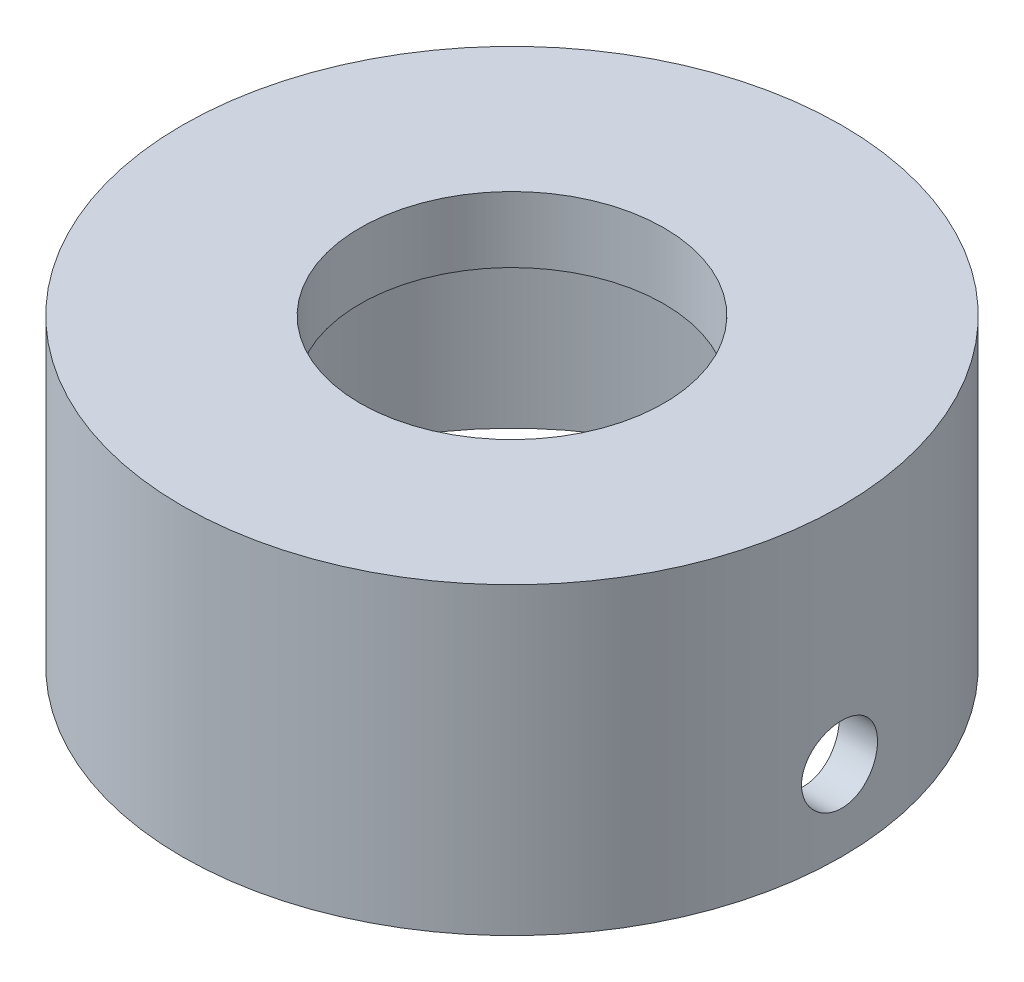
ISO-10303-21;
HEADER;
FILE_DESCRIPTION(('STEP AP214'),'2;1');
FILE_NAME('part.step','',(''),(''),'','','');
FILE_SCHEMA(('AUTOMOTIVE_DESIGN { 1 0 10303 214 1 1 1 1 }'));
ENDSEC;
DATA;
#1=APPLICATION_CONTEXT('core data for automotive mechanical design processes');
#2=APPLICATION_PROTOCOL_DEFINITION('international standard','automotive_design',2000,#1);
#3=PRODUCT_CONTEXT('',#1,'mechanical');
#4=PRODUCT('Part','Part','',(#3));
#5=PRODUCT_RELATED_PRODUCT_CATEGORY('part','',(#4));
#6=PRODUCT_DEFINITION_FORMATION('','',#4);
#7=PRODUCT_DEFINITION_CONTEXT('part definition',#1,'design');
#8=PRODUCT_DEFINITION('design','',#6,#7);
#9=PRODUCT_DEFINITION_SHAPE('','',#8);
#10=(LENGTH_UNIT() NAMED_UNIT(*) SI_UNIT(.MILLI.,.METRE.));
#11=(NAMED_UNIT(*) PLANE_ANGLE_UNIT() SI_UNIT($,.RADIAN.));
#12=(NAMED_UNIT(*) SI_UNIT($,.STERADIAN.) SOLID_ANGLE_UNIT());
#13=UNCERTAINTY_MEASURE_WITH_UNIT(LENGTH_MEASURE(1.E-05),#10,'distance_accuracy_value','');
#14=(GEOMETRIC_REPRESENTATION_CONTEXT(3) GLOBAL_UNCERTAINTY_ASSIGNED_CONTEXT((#13)) GLOBAL_UNIT_ASSIGNED_CONTEXT((#10,
#11,#12)) REPRESENTATION_CONTEXT('',''));
#15=CARTESIAN_POINT('',(0.,0.,0.));
#16=DIRECTION('',(0.,0.,1.));
#17=DIRECTION('',(1.,0.,0.));
#18=AXIS2_PLACEMENT_3D('',#15,#16,#17);
#19=CARTESIAN_POINT('',(0.,-19.05,0.));
#20=DIRECTION('',(0.,1.,0.));
#21=DIRECTION('',(0.,0.,1.));
#22=AXIS2_PLACEMENT_3D('',#19,#20,#21);
#23=CYLINDRICAL_SURFACE('',#22,9.525);
#24=CARTESIAN_POINT('',(0.,0.,0.));
#25=DIRECTION('',(0.,1.,0.));
#26=DIRECTION('',(0.,0.,1.));
#27=AXIS2_PLACEMENT_3D('',#24,#25,#26);
#28=CIRCLE('',#27,9.525);
#29=CARTESIAN_POINT('',(0.,0.,9.525));
#30=VERTEX_POINT('',#29);
#31=EDGE_CURVE('E58',#30,#30,#28,.T.);
#32=CARTESIAN_POINT('',(0.,-4.1275,0.));
#33=DIRECTION('',(0.,-1.,0.));
#34=DIRECTION('',(0.,0.,-1.));
#35=AXIS2_PLACEMENT_3D('',#32,#33,#34);
#36=CIRCLE('',#35,9.525);
#37=CARTESIAN_POINT('',(0.,-4.1275,9.525));
#38=VERTEX_POINT('',#37);
#39=EDGE_CURVE('E56',#38,#38,#36,.F.);
#40=CARTESIAN_POINT('',(0.,0.,9.525));
#41=CARTESIAN_POINT('',(0.,-0.0429947916666661,9.525));
#42=CARTESIAN_POINT('',(0.,-0.0859895833333323,9.525));
#43=CARTESIAN_POINT('',(0.,-0.171979166666666,9.525));
#44=CARTESIAN_POINT('',(0.,-0.214973958333333,9.525));
#45=CARTESIAN_POINT('',(0.,-0.300963541666667,9.525));
#46=CARTESIAN_POINT('',(0.,-0.343958333333333,9.525));
#47=CARTESIAN_POINT('',(0.,-0.429947916666666,9.525));
#48=CARTESIAN_POINT('',(0.,-0.472942708333333,9.525));
#49=CARTESIAN_POINT('',(0.,-0.558932291666667,9.525));
#50=CARTESIAN_POINT('',(0.,-0.601927083333333,9.525));
#51=CARTESIAN_POINT('',(0.,-0.687916666666667,9.525));
#52=CARTESIAN_POINT('',(0.,-0.730911458333334,9.525));
#53=CARTESIAN_POINT('',(0.,-0.816901041666667,9.525));
#54=CARTESIAN_POINT('',(0.,-0.859895833333334,9.525));
#55=CARTESIAN_POINT('',(0.,-0.945885416666667,9.525));
#56=CARTESIAN_POINT('',(0.,-0.988880208333334,9.525));
#57=CARTESIAN_POINT('',(0.,-1.07486979166667,9.525));
#58=CARTESIAN_POINT('',(0.,-1.11786458333333,9.525));
#59=CARTESIAN_POINT('',(0.,-1.20385416666667,9.525));
#60=CARTESIAN_POINT('',(0.,-1.24684895833333,9.525));
#61=CARTESIAN_POINT('',(0.,-1.33283854166667,9.525));
#62=CARTESIAN_POINT('',(0.,-1.37583333333333,9.525));
#63=CARTESIAN_POINT('',(0.,-1.46182291666667,9.525));
#64=CARTESIAN_POINT('',(0.,-1.50481770833333,9.525));
#65=CARTESIAN_POINT('',(0.,-1.59080729166667,9.525));
#66=CARTESIAN_POINT('',(0.,-1.63380208333333,9.525));
#67=CARTESIAN_POINT('',(0.,-1.71979166666667,9.525));
#68=CARTESIAN_POINT('',(0.,-1.76278645833334,9.525));
#69=CARTESIAN_POINT('',(0.,-1.84877604166667,9.525));
#70=CARTESIAN_POINT('',(0.,-1.89177083333333,9.525));
#71=CARTESIAN_POINT('',(0.,-1.97776041666667,9.525));
#72=CARTESIAN_POINT('',(0.,-2.02075520833334,9.525));
#73=CARTESIAN_POINT('',(0.,-2.10674479166667,9.525));
#74=CARTESIAN_POINT('',(0.,-2.14973958333334,9.525));
#75=CARTESIAN_POINT('',(0.,-2.23572916666667,9.525));
#76=CARTESIAN_POINT('',(0.,-2.27872395833333,9.525));
#77=CARTESIAN_POINT('',(0.,-2.36471354166667,9.525));
#78=CARTESIAN_POINT('',(0.,-2.40770833333333,9.525));
#79=CARTESIAN_POINT('',(0.,-2.49369791666667,9.525));
#80=CARTESIAN_POINT('',(0.,-2.53669270833333,9.525));
#81=CARTESIAN_POINT('',(0.,-2.62268229166667,9.525));
#82=CARTESIAN_POINT('',(0.,-2.66567708333333,9.525));
#83=CARTESIAN_POINT('',(0.,-2.75166666666667,9.525));
#84=CARTESIAN_POINT('',(0.,-2.79466145833333,9.525));
#85=CARTESIAN_POINT('',(0.,-2.88065104166667,9.525));
#86=CARTESIAN_POINT('',(0.,-2.92364583333334,9.525));
#87=CARTESIAN_POINT('',(0.,-3.00963541666667,9.525));
#88=CARTESIAN_POINT('',(0.,-3.05263020833334,9.525));
#89=CARTESIAN_POINT('',(0.,-3.13861979166667,9.525));
#90=CARTESIAN_POINT('',(0.,-3.18161458333334,9.525));
#91=CARTESIAN_POINT('',(0.,-3.26760416666667,9.525));
#92=CARTESIAN_POINT('',(0.,-3.31059895833334,9.525));
#93=CARTESIAN_POINT('',(0.,-3.39658854166667,9.525));
#94=CARTESIAN_POINT('',(0.,-3.43958333333333,9.525));
#95=CARTESIAN_POINT('',(0.,-3.52557291666667,9.525));
#96=CARTESIAN_POINT('',(0.,-3.56856770833333,9.525));
#97=CARTESIAN_POINT('',(0.,-3.65455729166667,9.525));
#98=CARTESIAN_POINT('',(0.,-3.69755208333333,9.525));
#99=CARTESIAN_POINT('',(0.,-3.78354166666667,9.525));
#100=CARTESIAN_POINT('',(0.,-3.82653645833333,9.525));
#101=CARTESIAN_POINT('',(0.,-3.91252604166667,9.525));
#102=CARTESIAN_POINT('',(0.,-3.95552083333333,9.525));
#103=CARTESIAN_POINT('',(0.,-4.04151041666667,9.525));
#104=CARTESIAN_POINT('',(0.,-4.08450520833333,9.525));
#105=CARTESIAN_POINT('',(0.,-4.1275,9.525));
#106=B_SPLINE_CURVE_WITH_KNOTS('',3,(#40,#41,#42,#43,#44,#45,#46,#47,#48,#49,#50,#51,#52,#53,
#54,#55,#56,#57,#58,#59,#60,#61,#62,#63,#64,#65,#66,#67,#68,#69,#70,#71,#72,#73,#74,#75,#76,#77,
#78,#79,#80,#81,#82,#83,#84,#85,#86,#87,#88,#89,#90,#91,#92,#93,#94,#95,#96,#97,#98,#99,#100,
#101,#102,#103,#104,#105),.UNSPECIFIED.,.F.,.F.,(4,2,2,2,2,2,2,2,2,2,2,2,2,2,2,2,2,2,2,2,2,2,2,
2,2,2,2,2,2,2,2,2,4),(0.,0.128984374999998,0.25796875,0.386953124999999,0.515937500000001,
0.644921874999999,0.773906250000001,0.902890625,1.031875,1.160859375,1.28984375,1.418828125,
1.5478125,1.676796875,1.80578125,1.934765625,2.06375,2.192734375,2.32171875,2.450703125,
2.5796875,2.708671875,2.83765625,2.966640625,3.095625,3.224609375,3.35359375,3.482578125,
3.6115625,3.740546875,3.86953125,3.998515625,4.1275),.UNSPECIFIED.);
#107=EDGE_CURVE('BSEAM32',#30,#38,#106,.T.);
#108=ORIENTED_EDGE('',*,*,#31,.T.);
#109=ORIENTED_EDGE('',*,*,#39,.F.);
#110=ORIENTED_EDGE('',*,*,#107,.T.);
#111=ORIENTED_EDGE('',*,*,#107,.F.);
#112=EDGE_LOOP('',(#108,#110,#109,#111));
#113=FACE_BOUND('',#112,.T.);
#114=ADVANCED_FACE('F32',(#113),#23,.F.);
#115=CARTESIAN_POINT('',(0.,-19.05,0.));
#116=DIRECTION('',(0.,1.,0.));
#117=DIRECTION('',(0.,0.,1.));
#118=AXIS2_PLACEMENT_3D('',#115,#116,#117);
#119=CYLINDRICAL_SURFACE('',#118,20.66925);
#120=CARTESIAN_POINT('',(-20.66925,-11.65225,0.));
#121=CARTESIAN_POINT('',(-20.669248263077,-11.6522557108431,-0.133282101014154));
#122=CARTESIAN_POINT('',(-20.6679471798083,-11.6634777030084,-0.266649511790171));
#123=CARTESIAN_POINT('',(-20.6628820330367,-11.7080705214079,-0.529678895517219));
#124=CARTESIAN_POINT('',(-20.6591153385506,-11.7414650078234,-0.659336755687313));
#125=CARTESIAN_POINT('',(-20.6495436650439,-11.8294108069728,-0.911100628269493));
#126=CARTESIAN_POINT('',(-20.6437399996008,-11.8839484874994,-1.03321144798518));
#127=CARTESIAN_POINT('',(-20.6307413145014,-12.012604083965,-1.26652212246347));
#128=CARTESIAN_POINT('',(-20.6235465493894,-12.0867184186624,-1.37772396775443));
#129=CARTESIAN_POINT('',(-20.6085321712339,-12.2527972314889,-1.58660849927668));
#130=CARTESIAN_POINT('',(-20.6007100611798,-12.3448353595614,-1.6842324545825));
#131=CARTESIAN_POINT('',(-20.5853429382,-12.5439913210551,-1.8626846014047));
#132=CARTESIAN_POINT('',(-20.5777979388476,-12.6511098919075,-1.94351197109189));
#133=CARTESIAN_POINT('',(-20.5638144318017,-12.8777623646645,-2.08629124318106));
#134=CARTESIAN_POINT('',(-20.5573791301346,-12.9973306902304,-2.14818884132314));
#135=CARTESIAN_POINT('',(-20.5463759038668,-13.2452510810466,-2.25100476396389));
#136=CARTESIAN_POINT('',(-20.5418079188455,-13.3736028619341,-2.29192376727711));
#137=CARTESIAN_POINT('',(-20.5350799466034,-13.6348409825155,-2.35144413472007));
#138=CARTESIAN_POINT('',(-20.5329093312233,-13.7677045944783,-2.37014403011372));
#139=CARTESIAN_POINT('',(-20.5311891780485,-14.0347007304639,-2.38500012206609));
#140=CARTESIAN_POINT('',(-20.5316395501575,-14.1688332107112,-2.38115709353598));
#141=CARTESIAN_POINT('',(-20.5351007640432,-14.4338760129371,-2.35111744243651));
#142=CARTESIAN_POINT('',(-20.5380992194161,-14.5647987754064,-2.32502895445263));
#143=CARTESIAN_POINT('',(-20.5462994250412,-14.8203954249362,-2.25140746488244));
#144=CARTESIAN_POINT('',(-20.5515012137591,-14.9450692028598,-2.20387408891188));
#145=CARTESIAN_POINT('',(-20.5635361186033,-15.1849671525314,-2.08859458857701));
#146=CARTESIAN_POINT('',(-20.5703730527885,-15.300168346954,-2.02080106296767));
#147=CARTESIAN_POINT('',(-20.5849048464295,-15.5175993547753,-1.86695964227599));
#148=CARTESIAN_POINT('',(-20.5925997392292,-15.6198286636994,-1.78091103760417));
#149=CARTESIAN_POINT('',(-20.6080355640445,-15.8090419369866,-1.59240082371126));
#150=CARTESIAN_POINT('',(-20.615776501445,-15.8959329916167,-1.48984593154622));
#151=CARTESIAN_POINT('',(-20.6303898441605,-16.0512812037243,-1.2715566193825));
#152=CARTESIAN_POINT('',(-20.6372622479514,-16.1197383288525,-1.15582217625595));
#153=CARTESIAN_POINT('',(-20.6493675735207,-16.2362739145537,-0.914390427957393));
#154=CARTESIAN_POINT('',(-20.6546000643037,-16.284347019048,-0.788690514557274));
#155=CARTESIAN_POINT('',(-20.6628319241393,-16.3586785617708,-0.530929178317458));
#156=CARTESIAN_POINT('',(-20.6658313819213,-16.3849378667737,-0.398868008463851));
#157=CARTESIAN_POINT('',(-20.6692477465197,-16.41477705394,-0.13293675412025));
#158=CARTESIAN_POINT('',(-20.6696792376698,-16.4184850153009,0.000918779261839986));
#159=CARTESIAN_POINT('',(-20.6679503164661,-16.4034535915521,0.267344328670689));
#160=CARTESIAN_POINT('',(-20.6657899508357,-16.3847146110929,0.399914367827595));
#161=CARTESIAN_POINT('',(-20.6591292305178,-16.3254275799692,0.659631277198224));
#162=CARTESIAN_POINT('',(-20.6546353801959,-16.2849401402966,0.786792164392998));
#163=CARTESIAN_POINT('',(-20.6438112132228,-16.1833681907582,1.03251848117205));
#164=CARTESIAN_POINT('',(-20.6374808428918,-16.1222830788344,1.15108365938566));
#165=CARTESIAN_POINT('',(-20.6236539665961,-15.9809366504814,1.37682790766961));
#166=CARTESIAN_POINT('',(-20.6161524401901,-15.9005919399264,1.48395444909443));
#167=CARTESIAN_POINT('',(-20.6008393956953,-15.7231256463966,1.68324719608323));
#168=CARTESIAN_POINT('',(-20.5930278672178,-15.6260035008176,1.77541289975855));
#169=CARTESIAN_POINT('',(-20.5779306841633,-15.4171772870563,1.94261810732791));
#170=CARTESIAN_POINT('',(-20.570647741268,-15.3054052927975,2.01757305689535));
#171=CARTESIAN_POINT('',(-20.5574756219329,-15.0707840366538,2.14764613190881));
#172=CARTESIAN_POINT('',(-20.551586421171,-14.9479349681264,2.20276460352973));
#173=CARTESIAN_POINT('',(-20.5418864919658,-14.6949267683759,2.29146126234889));
#174=CARTESIAN_POINT('',(-20.5380710604672,-14.5647849225858,2.32508822041776));
#175=CARTESIAN_POINT('',(-20.5329367553565,-14.3006554148425,2.37000488597404));
#176=CARTESIAN_POINT('',(-20.5316177843877,-14.166667903069,2.38129546453305));
#177=CARTESIAN_POINT('',(-20.5316282650218,-13.8994912960084,2.38120452515172));
#178=CARTESIAN_POINT('',(-20.5329422008559,-13.7663021352212,2.36995583158293));
#179=CARTESIAN_POINT('',(-20.5380372070857,-13.503720136929,2.32538576954833));
#180=CARTESIAN_POINT('',(-20.5418182789023,-13.3743273016106,2.29206438836939));
#181=CARTESIAN_POINT('',(-20.5514169365184,-13.1230216342412,2.20433436924064));
#182=CARTESIAN_POINT('',(-20.557234003247,-13.0011069049713,2.14993110567493));
#183=CARTESIAN_POINT('',(-20.5702501591,-12.768116452789,2.02159484442901));
#184=CARTESIAN_POINT('',(-20.577449255164,-12.6570407843072,1.94766174868242));
#185=CARTESIAN_POINT('',(-20.5924691820061,-12.4482015124226,1.78186880192908));
#186=CARTESIAN_POINT('',(-20.6002933004258,-12.3505167934697,1.68990987768988));
#187=CARTESIAN_POINT('',(-20.6156521850255,-12.1719118263203,1.49087932948802));
#188=CARTESIAN_POINT('',(-20.6231868821197,-12.0909955607902,1.38380412539524));
#189=CARTESIAN_POINT('',(-20.6371445079349,-11.94800610568,1.15718700117598));
#190=CARTESIAN_POINT('',(-20.6435637394273,-11.885995084132,1.03760565062672));
#191=CARTESIAN_POINT('',(-20.6545288186484,-11.7830198254385,0.789723947065783));
#192=CARTESIAN_POINT('',(-20.6590767330405,-11.7420323576884,0.661433395884404));
#193=CARTESIAN_POINT('',(-20.6646709153768,-11.6922507891287,0.443710095373586));
#194=CARTESIAN_POINT('',(-20.6663798573534,-11.6772716023201,0.355658650427681));
#195=CARTESIAN_POINT('',(-20.66866997773,-11.6572693256403,0.178417544016262));
#196=CARTESIAN_POINT('',(-20.6692511628116,-11.6522461767824,0.0892278892974686));
#197=CARTESIAN_POINT('',(-20.66925,-11.65225,0.));
#198=B_SPLINE_CURVE_WITH_KNOTS('',3,(#120,#121,#122,#123,#124,#125,#126,#127,#128,#129,#130,
#131,#132,#133,#134,#135,#136,#137,#138,#139,#140,#141,#142,#143,#144,#145,#146,#147,#148,#149,
#150,#151,#152,#153,#154,#155,#156,#157,#158,#159,#160,#161,#162,#163,#164,#165,#166,#167,#168,
#169,#170,#171,#172,#173,#174,#175,#176,#177,#178,#179,#180,#181,#182,#183,#184,#185,#186,#187,
#188,#189,#190,#191,#192,#193,#194,#195,#196,#197),.UNSPECIFIED.,.T.,.F.,(4,2,2,2,2,2,2,2,2,2,2,
2,2,2,2,2,2,2,2,2,2,2,2,2,2,2,2,2,2,2,2,2,2,2,2,2,2,2,4),(0.,0.399520422059809,
0.799467857447057,1.19915785192896,1.59877477997488,2.00006979102138,2.40138443214961,
2.80383976188068,3.20628206834774,3.60693299201624,4.00757014342288,4.40627083832844,
4.80497849400886,5.20462637968861,5.60428980284795,6.00629674841562,6.40830439944868,
6.81041761612597,7.21251485401105,7.61232625247979,8.01213044366507,8.41082615395946,
8.80953351890736,9.20999950536651,9.61047892341414,10.012885646839,10.4152853473504,
10.8167686057413,11.2182362068249,11.6173449095626,12.0164538421738,12.4154610971899,
12.8144703558043,13.2157374532209,13.6170997464166,14.0197679871364,14.4219903237943,
14.6894574099875,14.9569229115093),.UNSPECIFIED.);
#199=CARTESIAN_POINT('',(-20.66925,-11.65225,0.));
#200=VERTEX_POINT('',#199);
#201=EDGE_CURVE('E85',#200,#200,#198,.T.);
#202=ORIENTED_EDGE('',*,*,#201,.F.);
#203=EDGE_LOOP('',(#202));
#204=FACE_BOUND('',#203,.T.);
#205=CARTESIAN_POINT('',(20.5316230240086,-14.0335,-2.38125));
#206=CARTESIAN_POINT('',(20.5316248041862,-13.9002212082969,-2.38124428622436));
#207=CARTESIAN_POINT('',(20.5329347717737,-13.7668570968232,-2.37002283250162));
#208=CARTESIAN_POINT('',(20.5380316505497,-13.5038345678205,-2.32543234716354));
#209=CARTESIAN_POINT('',(20.5418212090798,-13.3741802656722,-2.29203964379378));
#210=CARTESIAN_POINT('',(20.5514424605219,-13.1224239179086,-2.20409906020549));
#211=CARTESIAN_POINT('',(20.5572728290919,-13.000317034866,-2.14956489684316));
#212=CARTESIAN_POINT('',(20.5703171578742,-12.7670129614905,-2.02091758406577));
#213=CARTESIAN_POINT('',(20.5775308655511,-12.655813785493,-1.94680800731001));
#214=CARTESIAN_POINT('',(20.592567661389,-12.446926260176,-1.78073400926507));
#215=CARTESIAN_POINT('',(20.6003932145034,-12.3492974824471,-1.68869487426208));
#216=CARTESIAN_POINT('',(20.6157497145269,-12.1708360224401,-1.4895348713567));
#217=CARTESIAN_POINT('',(20.6232806472665,-12.0900041471907,-1.38241327921283));
#218=CARTESIAN_POINT('',(20.637224295003,-11.9472201475352,-1.15575813908208));
#219=CARTESIAN_POINT('',(20.6436338208971,-11.8853215043367,-1.03619068711609));
#220=CARTESIAN_POINT('',(20.6545854802862,-11.7825034089045,-0.788272194428243));
#221=CARTESIAN_POINT('',(20.6591276731142,-11.7415832900868,-0.659921432939316));
#222=CARTESIAN_POINT('',(20.6658155437613,-11.6820606154598,-0.398686515471475));
#223=CARTESIAN_POINT('',(20.667971810512,-11.6633594227662,-0.265825109425693));
#224=CARTESIAN_POINT('',(20.6696809793769,-11.6484999718357,0.00116670134130682));
#225=CARTESIAN_POINT('',(20.6692339693392,-11.6523409529078,0.135297063088819));
#226=CARTESIAN_POINT('',(20.6657955580934,-11.6823773464222,0.400348851939845));
#227=CARTESIAN_POINT('',(20.6628162303792,-11.7084666858853,0.531282478114288));
#228=CARTESIAN_POINT('',(20.6546616223798,-11.7820936378178,0.786900414828147));
#229=CARTESIAN_POINT('',(20.6494863057492,-11.8296316052801,0.911584621896489));
#230=CARTESIAN_POINT('',(20.6375005513362,-11.944920645271,1.15149527589966));
#231=CARTESIAN_POINT('',(20.6306863723581,-12.0127180531845,1.26669926187884));
#232=CARTESIAN_POINT('',(20.6161862057092,-12.1665677774397,1.48413420951648));
#233=CARTESIAN_POINT('',(20.6085001840711,-12.2526208051419,1.58636466539163));
#234=CARTESIAN_POINT('',(20.5930648093287,-12.4411341762189,1.77557300244269));
#235=CARTESIAN_POINT('',(20.58531534764,-12.5436868945115,1.86245886516411));
#236=CARTESIAN_POINT('',(20.5706707511057,-12.7619700003246,2.01779763480657));
#237=CARTESIAN_POINT('',(20.5637756182641,-12.877700418752,2.08625049849379));
#238=CARTESIAN_POINT('',(20.5516202063968,-13.1191310354516,2.20278301073331));
#239=CARTESIAN_POINT('',(20.5463604623366,-13.2448344792392,2.25085599452166));
#240=CARTESIAN_POINT('',(20.5380820916107,-13.5026034953659,2.32518621586853));
#241=CARTESIAN_POINT('',(20.5350633736758,-13.634668808375,2.35144434187503));
#242=CARTESIAN_POINT('',(20.5316252102453,-13.9006020552185,2.38127907723511));
#243=CARTESIAN_POINT('',(20.5311909614155,-14.034455312806,2.38498486473899));
#244=CARTESIAN_POINT('',(20.5329317933226,-14.3008757899226,2.36994990551047));
#245=CARTESIAN_POINT('',(20.5351068269978,-14.4334430326029,2.35120956362233));
#246=CARTESIAN_POINT('',(20.5418076653542,-14.6931456988921,2.29192279569713));
#247=CARTESIAN_POINT('',(20.5463267919359,-14.8202954486744,2.25143830513154));
#248=CARTESIAN_POINT('',(20.5572012177025,-15.066000793699,2.14987597955304));
#249=CARTESIAN_POINT('',(20.5635565721258,-15.1845561302663,2.08879752501469));
#250=CARTESIAN_POINT('',(20.5774229940071,-15.4102935662534,1.94746095530093));
#251=CARTESIAN_POINT('',(20.5849391342043,-15.5174220771345,1.86711775617259));
#252=CARTESIAN_POINT('',(20.6002640555952,-15.716719500802,1.6896533181838));
#253=CARTESIAN_POINT('',(20.6080728464248,-15.8088879204726,1.59253152648368));
#254=CARTESIAN_POINT('',(20.6231483760892,-15.9760991494966,1.38370414964282));
#255=CARTESIAN_POINT('',(20.6304123228099,-16.0510573302866,1.27193057106294));
#256=CARTESIAN_POINT('',(20.6435384462458,-16.1811360721738,1.03730527010512));
#257=CARTESIAN_POINT('',(20.6494006475157,-16.236256980773,0.914453741833752));
#258=CARTESIAN_POINT('',(20.6590502958648,-16.3249552185204,0.661446971364801));
#259=CARTESIAN_POINT('',(20.6628425385237,-16.3585823745541,0.531309387719268));
#260=CARTESIAN_POINT('',(20.6679448089977,-16.4035008797149,0.267188881281841));
#261=CARTESIAN_POINT('',(20.6692549310709,-16.4147930770085,0.133206104706544));
#262=CARTESIAN_POINT('',(20.6692450687744,-16.4147069232424,-0.133973161472256));
#263=CARTESIAN_POINT('',(20.6679402656521,-16.4034594289595,-0.267169712946457));
#264=CARTESIAN_POINT('',(20.6628772250771,-16.358889168452,-0.529766795683909));
#265=CARTESIAN_POINT('',(20.6591189876525,-16.3255664024786,-0.659167326990342));
#266=CARTESIAN_POINT('',(20.6495697153412,-16.2378306404257,-0.910488649061942));
#267=CARTESIAN_POINT('',(20.6437791885484,-16.1834229154551,-1.0324113004341));
#268=CARTESIAN_POINT('',(20.6308083097158,-16.0550752739116,-1.26541573964594));
#269=CARTESIAN_POINT('',(20.6236279513292,-15.9811352681442,-1.37649747797727));
#270=CARTESIAN_POINT('',(20.6086303161824,-15.8153346458327,-1.58533657609757));
#271=CARTESIAN_POINT('',(20.6008097157285,-15.7233765414402,-1.68301630343599));
#272=CARTESIAN_POINT('',(20.5854403614117,-15.5243496970987,-1.86161158188358));
#273=CARTESIAN_POINT('',(20.5778916726984,-15.4172773656319,-1.9425231371447));
#274=CARTESIAN_POINT('',(20.5638942891244,-15.1906626567153,-2.08550743482166));
#275=CARTESIAN_POINT('',(20.5574493030125,-15.0710803292861,-2.14751718592135));
#276=CARTESIAN_POINT('',(20.5464327142997,-14.8231965696466,-2.25048980008683));
#277=CARTESIAN_POINT('',(20.5418590436433,-14.6949049462617,-2.29147590988777));
#278=CARTESIAN_POINT('',(20.5362315020304,-14.4771852666691,-2.34125371322803));
#279=CARTESIAN_POINT('',(20.5345117461166,-14.3891387802221,-2.35623120524429));
#280=CARTESIAN_POINT('',(20.5322069146823,-14.211907603478,-2.37623123095723));
#281=CARTESIAN_POINT('',(20.5316218322763,-14.1227229200911,-2.38125382506279));
#282=CARTESIAN_POINT('',(20.5316230240086,-14.0335,-2.38125));
#283=B_SPLINE_CURVE_WITH_KNOTS('',3,(#205,#206,#207,#208,#209,#210,#211,#212,#213,#214,#215,
#216,#217,#218,#219,#220,#221,#222,#223,#224,#225,#226,#227,#228,#229,#230,#231,#232,#233,#234,
#235,#236,#237,#238,#239,#240,#241,#242,#243,#244,#245,#246,#247,#248,#249,#250,#251,#252,#253,
#254,#255,#256,#257,#258,#259,#260,#261,#262,#263,#264,#265,#266,#267,#268,#269,#270,#271,#272,
#273,#274,#275,#276,#277,#278,#279,#280,#281,#282),.UNSPECIFIED.,.T.,.F.,(4,2,2,2,2,2,2,2,2,2,2,
2,2,2,2,2,2,2,2,2,2,2,2,2,2,2,2,2,2,2,2,2,2,2,2,2,2,2,4),(0.,0.399510480892373,
0.799448197709082,1.19912686280341,1.59873263389316,2.00004065566356,2.40136795433994,
2.80381864111171,3.20625653938628,3.6069011316576,4.00753220416067,4.4062638080618,
4.80500201154725,5.20465924173767,5.60433204809697,6.00632574020996,6.40832037517417,
6.81044637187694,7.21255599049693,7.61236017006156,8.01215713876208,8.4108213288937,
8.80949751305677,9.20996800366781,9.61045169194204,10.0128644183137,10.4152700950249,
10.8167394975102,11.2181936539688,11.6173238742038,12.0164540898986,12.4154845898177,
12.8145169119469,13.215771004542,13.6171206061408,14.019793462031,14.4220201003496,
14.6894723150998,14.956922906876),.UNSPECIFIED.);
#284=CARTESIAN_POINT('',(20.5316230240086,-14.0335,-2.38125));
#285=VERTEX_POINT('',#284);
#286=EDGE_CURVE('E81',#285,#285,#283,.T.);
#287=ORIENTED_EDGE('',*,*,#286,.F.);
#288=EDGE_LOOP('',(#287));
#289=FACE_BOUND('',#288,.T.);
#290=CARTESIAN_POINT('',(0.,-19.05,0.));
#291=DIRECTION('',(0.,1.,0.));
#292=DIRECTION('',(0.,0.,1.));
#293=AXIS2_PLACEMENT_3D('',#290,#291,#292);
#294=CIRCLE('',#293,20.66925);
#295=CARTESIAN_POINT('',(0.,-19.05,20.66925));
#296=VERTEX_POINT('',#295);
#297=EDGE_CURVE('E10',#296,#296,#294,.T.);
#298=ORIENTED_EDGE('',*,*,#297,.T.);
#299=EDGE_LOOP('',(#298));
#300=FACE_BOUND('',#299,.T.);
#301=CARTESIAN_POINT('',(0.,0.,0.));
#302=DIRECTION('',(0.,1.,0.));
#303=DIRECTION('',(0.,0.,1.));
#304=AXIS2_PLACEMENT_3D('',#301,#302,#303);
#305=CIRCLE('',#304,20.66925);
#306=CARTESIAN_POINT('',(0.,0.,20.66925));
#307=VERTEX_POINT('',#306);
#308=EDGE_CURVE('E45',#307,#307,#305,.T.);
#309=ORIENTED_EDGE('',*,*,#308,.F.);
#310=EDGE_LOOP('',(#309));
#311=FACE_BOUND('',#310,.T.);
#312=ADVANCED_FACE('F34',(#204,#289,#300,#311),#119,.T.);
#313=CARTESIAN_POINT('',(0.,-19.05,0.));
#314=DIRECTION('',(0.,1.,0.));
#315=DIRECTION('',(0.,0.,1.));
#316=AXIS2_PLACEMENT_3D('',#313,#314,#315);
#317=PLANE('',#316);
#318=CARTESIAN_POINT('',(0.,-19.05,0.));
#319=DIRECTION('',(0.,-1.,0.));
#320=DIRECTION('',(0.,0.,-1.));
#321=AXIS2_PLACEMENT_3D('',#318,#319,#320);
#322=CIRCLE('',#321,18.288);
#323=CARTESIAN_POINT('',(0.,-19.05,-18.288));
#324=VERTEX_POINT('',#323);
#325=EDGE_CURVE('E53',#324,#324,#322,.T.);
#326=ORIENTED_EDGE('',*,*,#325,.F.);
#327=EDGE_LOOP('',(#326));
#328=FACE_BOUND('',#327,.T.);
#329=ORIENTED_EDGE('',*,*,#297,.F.);
#330=EDGE_LOOP('',(#329));
#331=FACE_BOUND('',#330,.T.);
#332=ADVANCED_FACE('F103',(#328,#331),#317,.F.);
#333=CARTESIAN_POINT('',(0.,0.,0.));
#334=DIRECTION('',(0.,1.,0.));
#335=DIRECTION('',(0.,0.,1.));
#336=AXIS2_PLACEMENT_3D('',#333,#334,#335);
#337=PLANE('',#336);
#338=ORIENTED_EDGE('',*,*,#31,.F.);
#339=EDGE_LOOP('',(#338));
#340=FACE_BOUND('',#339,.T.);
#341=ORIENTED_EDGE('',*,*,#308,.T.);
#342=EDGE_LOOP('',(#341));
#343=FACE_BOUND('',#342,.T.);
#344=ADVANCED_FACE('F106',(#340,#343),#337,.T.);
#345=CARTESIAN_POINT('',(0.,-5.6515,0.));
#346=DIRECTION('',(0.,-1.,0.));
#347=DIRECTION('',(0.,0.,-1.));
#348=AXIS2_PLACEMENT_3D('',#345,#346,#347);
#349=CYLINDRICAL_SURFACE('',#348,18.288);
#350=CARTESIAN_POINT('',(-18.1323079732697,-14.0335,-2.38125));
#351=CARTESIAN_POINT('',(-18.1323099546316,-14.1666461557282,-2.38124436777442));
#352=CARTESIAN_POINT('',(-18.1337903593608,-14.2998743845857,-2.37004512185112));
#353=CARTESIAN_POINT('',(-18.1395494454875,-14.5626197664078,-2.32554806340818));
#354=CARTESIAN_POINT('',(-18.1438310132147,-14.6921329475301,-2.29222745642684));
#355=CARTESIAN_POINT('',(-18.1546994315108,-14.9436062586736,-2.20448952041425));
#356=CARTESIAN_POINT('',(-18.1612846776409,-15.0655715761426,-2.15008687152124));
#357=CARTESIAN_POINT('',(-18.176016536334,-15.2986201345193,-2.02176121939081));
#358=CARTESIAN_POINT('',(-18.1841628920342,-15.4097051611172,-1.94784142672141));
#359=CARTESIAN_POINT('',(-18.2011543637067,-15.6185348783338,-1.78210015253788));
#360=CARTESIAN_POINT('',(-18.2100030250248,-15.7162040635745,-1.69018388887936));
#361=CARTESIAN_POINT('',(-18.2273702540942,-15.8947769917928,-1.49126303497465));
#362=CARTESIAN_POINT('',(-18.2358888050813,-15.9756798842171,-1.38425767972206));
#363=CARTESIAN_POINT('',(-18.251672467296,-16.1186961911944,-1.157719585609));
#364=CARTESIAN_POINT('',(-18.2589329625201,-16.180741015023,-1.03814319558924));
#365=CARTESIAN_POINT('',(-18.2713434216526,-16.2838404735972,-0.790157463792271));
#366=CARTESIAN_POINT('',(-18.2764934702792,-16.3248959509189,-0.66174847681708));
#367=CARTESIAN_POINT('',(-18.2840777862242,-16.3846250007556,-0.400516106893276));
#368=CARTESIAN_POINT('',(-18.2865273061772,-16.4034243214452,-0.267721925356364));
#369=CARTESIAN_POINT('',(-18.2884866937971,-16.4184972707525,-0.000842596080298351));
#370=CARTESIAN_POINT('',(-18.2879966863787,-16.4147718565552,0.133242496560038));
#371=CARTESIAN_POINT('',(-18.284144540487,-16.3850015639456,0.398041454557641));
#372=CARTESIAN_POINT('',(-18.2807998064092,-16.359091932879,0.528770814105744));
#373=CARTESIAN_POINT('',(-18.2716335244419,-16.2859002748266,0.78401004964657));
#374=CARTESIAN_POINT('',(-18.2658119261138,-16.2386178126047,0.908519798925855));
#375=CARTESIAN_POINT('',(-18.2523160421318,-16.1238798876395,1.14820232862509));
#376=CARTESIAN_POINT('',(-18.24463642208,-16.0563662052685,1.26334692628014));
#377=CARTESIAN_POINT('',(-18.2282830537728,-15.9031246853626,1.48072321067695));
#378=CARTESIAN_POINT('',(-18.2196092560748,-15.8173959417732,1.58295425466865));
#379=CARTESIAN_POINT('',(-18.2021616731356,-15.6294010991602,1.77239657177973));
#380=CARTESIAN_POINT('',(-18.1933876233963,-15.5270170866549,1.85949084964768));
#381=CARTESIAN_POINT('',(-18.1767917596438,-15.3090222033414,2.01527722863238));
#382=CARTESIAN_POINT('',(-18.1689699490921,-15.1934112844533,2.08396926285379));
#383=CARTESIAN_POINT('',(-18.15516433465,-14.9521366939115,2.20100968162678));
#384=CARTESIAN_POINT('',(-18.1491814241521,-14.8264681732236,2.24934818202841));
#385=CARTESIAN_POINT('',(-18.1397481016394,-14.5687021272073,2.32420294409677));
#386=CARTESIAN_POINT('',(-18.136297556801,-14.4366049394527,2.35072035029758));
#387=CARTESIAN_POINT('',(-18.1323441270351,-14.1707660830384,2.38102418676139));
#388=CARTESIAN_POINT('',(-18.131819861766,-14.0370435156879,2.38497549713089));
#389=CARTESIAN_POINT('',(-18.1337217643738,-13.7708432866129,2.37047049675966));
#390=CARTESIAN_POINT('',(-18.1361478638679,-13.6383655961068,2.35201470536499));
#391=CARTESIAN_POINT('',(-18.1436576018117,-13.3789130058105,2.29335841911758));
#392=CARTESIAN_POINT('',(-18.1487314260505,-13.251919647088,2.25323820789463));
#393=CARTESIAN_POINT('',(-18.1609569406718,-13.0064622292377,2.15247475743202));
#394=CARTESIAN_POINT('',(-18.1681087099047,-12.8879984939911,2.09183073937369));
#395=CARTESIAN_POINT('',(-18.183735344842,-12.6622184286202,1.95133754395798));
#396=CARTESIAN_POINT('',(-18.192217543722,-12.5549697281118,1.87138051130862));
#397=CARTESIAN_POINT('',(-18.2095264725854,-12.3553551746397,1.69468294585679));
#398=CARTESIAN_POINT('',(-18.218353217123,-12.2629899512282,1.59794170346266));
#399=CARTESIAN_POINT('',(-18.2354225899017,-12.0951825589887,1.38970043828292));
#400=CARTESIAN_POINT('',(-18.243661255374,-12.0198489143581,1.27811259171651));
#401=CARTESIAN_POINT('',(-18.258566504684,-11.8889950411238,1.04377124678431));
#402=CARTESIAN_POINT('',(-18.2652331224914,-11.8334743843778,0.921017989765762));
#403=CARTESIAN_POINT('',(-18.2762255870603,-11.7440006057368,0.668186714309403));
#404=CARTESIAN_POINT('',(-18.2805581639694,-11.709985423583,0.538130962974686));
#405=CARTESIAN_POINT('',(-18.2864223917339,-11.6642864562949,0.274093784743687));
#406=CARTESIAN_POINT('',(-18.2879541801934,-11.6526015740608,0.140112551036894));
#407=CARTESIAN_POINT('',(-18.2880434513476,-11.6519166133483,-0.126914103731416));
#408=CARTESIAN_POINT('',(-18.2866228412004,-11.6627494507527,-0.259959119666481));
#409=CARTESIAN_POINT('',(-18.2810105946638,-11.706437723154,-0.522320178919563));
#410=CARTESIAN_POINT('',(-18.2768189613836,-11.7392931334409,-0.651636226421442));
#411=CARTESIAN_POINT('',(-18.2661334867168,-11.8260400769144,-0.902841939063063));
#412=CARTESIAN_POINT('',(-18.2596405982894,-11.8799229034938,-1.02473465378818));
#413=CARTESIAN_POINT('',(-18.2450704394169,-12.0071777928672,-1.25777450533631));
#414=CARTESIAN_POINT('',(-18.2369931436806,-12.0805501667706,-1.36892147058748));
#415=CARTESIAN_POINT('',(-18.2200835957146,-12.2453170226356,-1.57816733617135));
#416=CARTESIAN_POINT('',(-18.2112463933675,-12.3368356860298,-1.67616805850343));
#417=CARTESIAN_POINT('',(-18.1938521672718,-12.5350381117579,-1.8554852090103));
#418=CARTESIAN_POINT('',(-18.1852952102276,-12.6417254527573,-1.93679768892344));
#419=CARTESIAN_POINT('',(-18.1693920801582,-12.8677526294042,-2.08072496212844));
#420=CARTESIAN_POINT('',(-18.1620511294048,-12.9871435955388,-2.14326000180878));
#421=CARTESIAN_POINT('',(-18.1494723377373,-13.2347637579008,-2.24730254047079));
#422=CARTESIAN_POINT('',(-18.1442322308882,-13.3629832559028,-2.28883270767417));
#423=CARTESIAN_POINT('',(-18.1377089470523,-13.5821252266156,-2.33984318614738));
#424=CARTESIAN_POINT('',(-18.1356937926569,-13.6716705301322,-2.35534814092426));
#425=CARTESIAN_POINT('',(-18.1329926359199,-13.8519645098236,-2.37605342417243));
#426=CARTESIAN_POINT('',(-18.1323066222614,-13.942713175746,-2.3812538403803));
#427=CARTESIAN_POINT('',(-18.1323079732697,-14.0335,-2.38125));
#428=B_SPLINE_CURVE_WITH_KNOTS('',3,(#350,#351,#352,#353,#354,#355,#356,#357,#358,#359,#360,
#361,#362,#363,#364,#365,#366,#367,#368,#369,#370,#371,#372,#373,#374,#375,#376,#377,#378,#379,
#380,#381,#382,#383,#384,#385,#386,#387,#388,#389,#390,#391,#392,#393,#394,#395,#396,#397,#398,
#399,#400,#401,#402,#403,#404,#405,#406,#407,#408,#409,#410,#411,#412,#413,#414,#415,#416,#417,
#418,#419,#420,#421,#422,#423,#424,#425,#426,#427),.UNSPECIFIED.,.T.,.F.,(4,2,2,2,2,2,2,2,2,2,2,
2,2,2,2,2,2,2,2,2,2,2,2,2,2,2,2,2,2,2,2,2,2,2,2,2,2,2,4),(0.,0.399106775212302,
0.798625440701387,1.19786640629448,1.59704173766542,1.99837888337607,2.39973638391993,
2.80253670170304,3.20532084859106,3.60581821986622,4.00629857218843,4.40435461756185,
4.80241876931063,5.20163961908065,5.60088033156326,6.00308148056987,6.40528409162733,
6.80768179699788,7.21005839493693,7.60949121288234,8.00891477305279,8.4068682138268,
8.80483675746788,9.20508137925373,9.60534292644041,10.0080872192221,10.410822808506,
10.8123908183714,11.2139390984739,11.612518482116,12.0110974185387,12.4095114942685,
12.8079319302203,13.209179348501,13.6105215885211,14.0135450957851,14.4161327315813,
14.6882693544673,14.9604036602729),.UNSPECIFIED.);
#429=CARTESIAN_POINT('',(-18.1323079732697,-14.0335,-2.38125));
#430=VERTEX_POINT('',#429);
#431=EDGE_CURVE('E37',#430,#430,#428,.T.);
#432=ORIENTED_EDGE('',*,*,#431,.T.);
#433=EDGE_LOOP('',(#432));
#434=FACE_BOUND('',#433,.T.);
#435=CARTESIAN_POINT('',(18.1323079732697,-14.0335,-2.38125));
#436=CARTESIAN_POINT('',(18.1323099546316,-13.9003538442718,-2.38124436777442));
#437=CARTESIAN_POINT('',(18.1337903593608,-13.7671256154143,-2.37004512185112));
#438=CARTESIAN_POINT('',(18.1395494454875,-13.5043802335922,-2.32554806340818));
#439=CARTESIAN_POINT('',(18.1438310132147,-13.3748670524699,-2.29222745642684));
#440=CARTESIAN_POINT('',(18.1546994315108,-13.1233937413264,-2.20448952041425));
#441=CARTESIAN_POINT('',(18.1612846776409,-13.0014284238574,-2.15008687152124));
#442=CARTESIAN_POINT('',(18.176016536334,-12.7683798654807,-2.02176121939081));
#443=CARTESIAN_POINT('',(18.1841628920342,-12.6572948388828,-1.94784142672141));
#444=CARTESIAN_POINT('',(18.2011543637067,-12.4484651216662,-1.78210015253788));
#445=CARTESIAN_POINT('',(18.2100030250248,-12.3507959364255,-1.69018388887937));
#446=CARTESIAN_POINT('',(18.2273702540942,-12.1722230082072,-1.49126303497465));
#447=CARTESIAN_POINT('',(18.2358888050813,-12.0913201157829,-1.38425767972206));
#448=CARTESIAN_POINT('',(18.251672467296,-11.9483038088056,-1.157719585609));
#449=CARTESIAN_POINT('',(18.2589329625201,-11.886258984977,-1.03814319558924));
#450=CARTESIAN_POINT('',(18.2713434216526,-11.7831595264028,-0.79015746379227));
#451=CARTESIAN_POINT('',(18.2764934702792,-11.7421040490811,-0.661748476817079));
#452=CARTESIAN_POINT('',(18.2840777862242,-11.6823749992444,-0.400516106893276));
#453=CARTESIAN_POINT('',(18.2865273061772,-11.6635756785548,-0.267721925356365));
#454=CARTESIAN_POINT('',(18.2884866937971,-11.6485027292475,-0.000842596080298893));
#455=CARTESIAN_POINT('',(18.2879966863787,-11.6522281434448,0.133242496560038));
#456=CARTESIAN_POINT('',(18.284144540487,-11.6819984360544,0.398041454557641));
#457=CARTESIAN_POINT('',(18.2807998064092,-11.707908067121,0.528770814105745));
#458=CARTESIAN_POINT('',(18.2716335244419,-11.7810997251734,0.784010049646571));
#459=CARTESIAN_POINT('',(18.2658119261138,-11.8283821873953,0.908519798925856));
#460=CARTESIAN_POINT('',(18.2523160421318,-11.9431201123605,1.14820232862509));
#461=CARTESIAN_POINT('',(18.24463642208,-12.0106337947315,1.26334692628014));
#462=CARTESIAN_POINT('',(18.2282830537728,-12.1638753146374,1.48072321067695));
#463=CARTESIAN_POINT('',(18.2196092560748,-12.2496040582268,1.58295425466865));
#464=CARTESIAN_POINT('',(18.2021616731356,-12.4375989008398,1.77239657177973));
#465=CARTESIAN_POINT('',(18.1933876233963,-12.5399829133451,1.85949084964768));
#466=CARTESIAN_POINT('',(18.1767917596438,-12.7579777966586,2.01527722863238));
#467=CARTESIAN_POINT('',(18.1689699490921,-12.8735887155467,2.0839692628538));
#468=CARTESIAN_POINT('',(18.15516433465,-13.1148633060885,2.20100968162678));
#469=CARTESIAN_POINT('',(18.1491814241521,-13.2405318267764,2.24934818202841));
#470=CARTESIAN_POINT('',(18.1397481016394,-13.4982978727927,2.32420294409676));
#471=CARTESIAN_POINT('',(18.136297556801,-13.6303950605473,2.35072035029758));
#472=CARTESIAN_POINT('',(18.1323441270351,-13.8962339169616,2.38102418676139));
#473=CARTESIAN_POINT('',(18.131819861766,-14.0299564843121,2.38497549713089));
#474=CARTESIAN_POINT('',(18.1337217643738,-14.2961567133871,2.37047049675966));
#475=CARTESIAN_POINT('',(18.1361478638679,-14.4286344038933,2.35201470536499));
#476=CARTESIAN_POINT('',(18.1436576018117,-14.6880869941895,2.29335841911758));
#477=CARTESIAN_POINT('',(18.1487314260505,-14.815080352912,2.25323820789463));
#478=CARTESIAN_POINT('',(18.1609569406718,-15.0605377707623,2.15247475743202));
#479=CARTESIAN_POINT('',(18.1681087099047,-15.1790015060089,2.09183073937369));
#480=CARTESIAN_POINT('',(18.183735344842,-15.4047815713798,1.95133754395798));
#481=CARTESIAN_POINT('',(18.192217543722,-15.5120302718882,1.87138051130862));
#482=CARTESIAN_POINT('',(18.2095264725854,-15.7116448253603,1.69468294585679));
#483=CARTESIAN_POINT('',(18.218353217123,-15.8040100487718,1.59794170346266));
#484=CARTESIAN_POINT('',(18.2354225899017,-15.9718174410113,1.38970043828293));
#485=CARTESIAN_POINT('',(18.243661255374,-16.0471510856419,1.27811259171651));
#486=CARTESIAN_POINT('',(18.258566504684,-16.1780049588762,1.04377124678432));
#487=CARTESIAN_POINT('',(18.2652331224914,-16.2335256156222,0.921017989765762));
#488=CARTESIAN_POINT('',(18.2762255870603,-16.3229993942632,0.668186714309402));
#489=CARTESIAN_POINT('',(18.2805581639694,-16.3570145764171,0.538130962974685));
#490=CARTESIAN_POINT('',(18.2864223917339,-16.4027135437051,0.274093784743686));
#491=CARTESIAN_POINT('',(18.2879541801934,-16.4143984259392,0.140112551036894));
#492=CARTESIAN_POINT('',(18.2880434513476,-16.4150833866517,-0.126914103731414));
#493=CARTESIAN_POINT('',(18.2866228412004,-16.4042505492473,-0.259959119666478));
#494=CARTESIAN_POINT('',(18.2810105946638,-16.360562276846,-0.52232017891956));
#495=CARTESIAN_POINT('',(18.2768189613836,-16.3277068665591,-0.651636226421441));
#496=CARTESIAN_POINT('',(18.2661334867168,-16.2409599230856,-0.902841939063063));
#497=CARTESIAN_POINT('',(18.2596405982894,-16.1870770965062,-1.02473465378818));
#498=CARTESIAN_POINT('',(18.2450704394169,-16.0598222071328,-1.25777450533631));
#499=CARTESIAN_POINT('',(18.2369931436806,-15.9864498332294,-1.36892147058747));
#500=CARTESIAN_POINT('',(18.2200835957146,-15.8216829773644,-1.57816733617135));
#501=CARTESIAN_POINT('',(18.2112463933675,-15.7301643139702,-1.67616805850343));
#502=CARTESIAN_POINT('',(18.1938521672718,-15.5319618882422,-1.85548520901029));
#503=CARTESIAN_POINT('',(18.1852952102276,-15.4252745472427,-1.93679768892344));
#504=CARTESIAN_POINT('',(18.1693920801582,-15.1992473705958,-2.08072496212843));
#505=CARTESIAN_POINT('',(18.1620511294048,-15.0798564044613,-2.14326000180878));
#506=CARTESIAN_POINT('',(18.1494723377373,-14.8322362420993,-2.24730254047079));
#507=CARTESIAN_POINT('',(18.1442322308882,-14.7040167440973,-2.28883270767417));
#508=CARTESIAN_POINT('',(18.1377089470523,-14.4848747733844,-2.33984318614738));
#509=CARTESIAN_POINT('',(18.1356937926569,-14.3953294698678,-2.35534814092426));
#510=CARTESIAN_POINT('',(18.1329926359199,-14.2150354901764,-2.37605342417243));
#511=CARTESIAN_POINT('',(18.1323066222614,-14.124286824254,-2.3812538403803));
#512=CARTESIAN_POINT('',(18.1323079732697,-14.0335,-2.38125));
#513=B_SPLINE_CURVE_WITH_KNOTS('',3,(#435,#436,#437,#438,#439,#440,#441,#442,#443,#444,#445,
#446,#447,#448,#449,#450,#451,#452,#453,#454,#455,#456,#457,#458,#459,#460,#461,#462,#463,#464,
#465,#466,#467,#468,#469,#470,#471,#472,#473,#474,#475,#476,#477,#478,#479,#480,#481,#482,#483,
#484,#485,#486,#487,#488,#489,#490,#491,#492,#493,#494,#495,#496,#497,#498,#499,#500,#501,#502,
#503,#504,#505,#506,#507,#508,#509,#510,#511,#512),.UNSPECIFIED.,.T.,.F.,(4,2,2,2,2,2,2,2,2,2,2,
2,2,2,2,2,2,2,2,2,2,2,2,2,2,2,2,2,2,2,2,2,2,2,2,2,2,2,4),(0.,0.399106775212302,
0.798625440701387,1.19786640629448,1.59704173766542,1.99837888337608,2.39973638391994,
2.80253670170305,3.20532084859106,3.60581821986622,4.00629857218843,4.40435461756185,
4.80241876931063,5.20163961908065,5.60088033156326,6.00308148056987,6.40528409162733,
6.80768179699788,7.21005839493693,7.60949121288234,8.00891477305279,8.4068682138268,
8.80483675746788,9.20508137925373,9.60534292644041,10.0080872192221,10.410822808506,
10.8123908183714,11.2139390984739,11.612518482116,12.0110974185387,12.4095114942685,
12.8079319302203,13.209179348501,13.6105215885211,14.0135450957851,14.4161327315813,
14.6882693544673,14.9604036602729),.UNSPECIFIED.);
#514=CARTESIAN_POINT('',(18.1323079732697,-14.0335,-2.38125));
#515=VERTEX_POINT('',#514);
#516=EDGE_CURVE('E60',#515,#515,#513,.T.);
#517=ORIENTED_EDGE('',*,*,#516,.T.);
#518=EDGE_LOOP('',(#517));
#519=FACE_BOUND('',#518,.T.);
#520=CARTESIAN_POINT('',(0.,-5.6515,0.));
#521=DIRECTION('',(0.,-1.,0.));
#522=DIRECTION('',(0.,0.,-1.));
#523=AXIS2_PLACEMENT_3D('',#520,#521,#522);
#524=CIRCLE('',#523,18.288);
#525=CARTESIAN_POINT('',(0.,-5.6515,-18.288));
#526=VERTEX_POINT('',#525);
#527=EDGE_CURVE('E50',#526,#526,#524,.T.);
#528=ORIENTED_EDGE('',*,*,#527,.F.);
#529=EDGE_LOOP('',(#528));
#530=FACE_BOUND('',#529,.T.);
#531=ORIENTED_EDGE('',*,*,#325,.T.);
#532=EDGE_LOOP('',(#531));
#533=FACE_BOUND('',#532,.T.);
#534=ADVANCED_FACE('F64',(#434,#519,#530,#533),#349,.F.);
#535=CARTESIAN_POINT('',(0.,-5.6515,0.));
#536=DIRECTION('',(0.,-1.,0.));
#537=DIRECTION('',(0.,0.,-1.));
#538=AXIS2_PLACEMENT_3D('',#535,#536,#537);
#539=PLANE('',#538);
#540=CARTESIAN_POINT('',(0.,-5.6515,0.));
#541=DIRECTION('',(0.,-1.,0.));
#542=DIRECTION('',(0.,0.,-1.));
#543=AXIS2_PLACEMENT_3D('',#540,#541,#542);
#544=CIRCLE('',#543,15.875);
#545=CARTESIAN_POINT('',(0.,-5.6515,-15.875));
#546=VERTEX_POINT('',#545);
#547=EDGE_CURVE('E90',#546,#546,#544,.T.);
#548=ORIENTED_EDGE('',*,*,#547,.F.);
#549=EDGE_LOOP('',(#548));
#550=FACE_BOUND('',#549,.T.);
#551=ORIENTED_EDGE('',*,*,#527,.T.);
#552=EDGE_LOOP('',(#551));
#553=FACE_BOUND('',#552,.T.);
#554=ADVANCED_FACE('F121',(#550,#553),#539,.T.);
#555=CARTESIAN_POINT('',(0.,-4.1275,0.));
#556=DIRECTION('',(0.,-1.,0.));
#557=DIRECTION('',(0.,0.,-1.));
#558=AXIS2_PLACEMENT_3D('',#555,#556,#557);
#559=PLANE('',#558);
#560=CARTESIAN_POINT('',(0.,-4.1275,0.));
#561=DIRECTION('',(0.,-1.,0.));
#562=DIRECTION('',(0.,0.,-1.));
#563=AXIS2_PLACEMENT_3D('',#560,#561,#562);
#564=CIRCLE('',#563,15.875);
#565=CARTESIAN_POINT('',(0.,-4.1275,-15.875));
#566=VERTEX_POINT('',#565);
#567=EDGE_CURVE('E59',#566,#566,#564,.T.);
#568=ORIENTED_EDGE('',*,*,#567,.T.);
#569=EDGE_LOOP('',(#568));
#570=FACE_BOUND('',#569,.T.);
#571=ORIENTED_EDGE('',*,*,#39,.T.);
#572=EDGE_LOOP('',(#571));
#573=FACE_BOUND('',#572,.T.);
#574=ADVANCED_FACE('F74',(#570,#573),#559,.T.);
#575=CARTESIAN_POINT('',(0.,-4.1275,0.));
#576=DIRECTION('',(0.,-1.,0.));
#577=DIRECTION('',(0.,0.,-1.));
#578=AXIS2_PLACEMENT_3D('',#575,#576,#577);
#579=CYLINDRICAL_SURFACE('',#578,15.875);
#580=CARTESIAN_POINT('',(0.,-4.1275,-15.875));
#581=CARTESIAN_POINT('',(0.,-4.143375,-15.875));
#582=CARTESIAN_POINT('',(0.,-4.15925,-15.875));
#583=CARTESIAN_POINT('',(0.,-4.191,-15.875));
#584=CARTESIAN_POINT('',(0.,-4.206875,-15.875));
#585=CARTESIAN_POINT('',(0.,-4.238625,-15.875));
#586=CARTESIAN_POINT('',(0.,-4.2545,-15.875));
#587=CARTESIAN_POINT('',(0.,-4.28625,-15.875));
#588=CARTESIAN_POINT('',(0.,-4.302125,-15.875));
#589=CARTESIAN_POINT('',(0.,-4.333875,-15.875));
#590=CARTESIAN_POINT('',(0.,-4.34975,-15.875));
#591=CARTESIAN_POINT('',(0.,-4.3815,-15.875));
#592=CARTESIAN_POINT('',(0.,-4.397375,-15.875));
#593=CARTESIAN_POINT('',(0.,-4.429125,-15.875));
#594=CARTESIAN_POINT('',(0.,-4.445,-15.875));
#595=CARTESIAN_POINT('',(0.,-4.47675,-15.875));
#596=CARTESIAN_POINT('',(0.,-4.492625,-15.875));
#597=CARTESIAN_POINT('',(0.,-4.524375,-15.875));
#598=CARTESIAN_POINT('',(0.,-4.54025,-15.875));
#599=CARTESIAN_POINT('',(0.,-4.572,-15.875));
#600=CARTESIAN_POINT('',(0.,-4.587875,-15.875));
#601=CARTESIAN_POINT('',(0.,-4.619625,-15.875));
#602=CARTESIAN_POINT('',(0.,-4.6355,-15.875));
#603=CARTESIAN_POINT('',(0.,-4.66725,-15.875));
#604=CARTESIAN_POINT('',(0.,-4.683125,-15.875));
#605=CARTESIAN_POINT('',(0.,-4.714875,-15.875));
#606=CARTESIAN_POINT('',(0.,-4.73075,-15.875));
#607=CARTESIAN_POINT('',(0.,-4.7625,-15.875));
#608=CARTESIAN_POINT('',(0.,-4.778375,-15.875));
#609=CARTESIAN_POINT('',(0.,-4.810125,-15.875));
#610=CARTESIAN_POINT('',(0.,-4.826,-15.875));
#611=CARTESIAN_POINT('',(0.,-4.85775,-15.875));
#612=CARTESIAN_POINT('',(0.,-4.873625,-15.875));
#613=CARTESIAN_POINT('',(0.,-4.905375,-15.875));
#614=CARTESIAN_POINT('',(0.,-4.92125,-15.875));
#615=CARTESIAN_POINT('',(0.,-4.953,-15.875));
#616=CARTESIAN_POINT('',(0.,-4.968875,-15.875));
#617=CARTESIAN_POINT('',(0.,-5.000625,-15.875));
#618=CARTESIAN_POINT('',(0.,-5.0165,-15.875));
#619=CARTESIAN_POINT('',(0.,-5.04825,-15.875));
#620=CARTESIAN_POINT('',(0.,-5.064125,-15.875));
#621=CARTESIAN_POINT('',(0.,-5.095875,-15.875));
#622=CARTESIAN_POINT('',(0.,-5.11175,-15.875));
#623=CARTESIAN_POINT('',(0.,-5.1435,-15.875));
#624=CARTESIAN_POINT('',(0.,-5.159375,-15.875));
#625=CARTESIAN_POINT('',(0.,-5.191125,-15.875));
#626=CARTESIAN_POINT('',(0.,-5.207,-15.875));
#627=CARTESIAN_POINT('',(0.,-5.23875,-15.875));
#628=CARTESIAN_POINT('',(0.,-5.254625,-15.875));
#629=CARTESIAN_POINT('',(0.,-5.286375,-15.875));
#630=CARTESIAN_POINT('',(0.,-5.30225,-15.875));
#631=CARTESIAN_POINT('',(0.,-5.334,-15.875));
#632=CARTESIAN_POINT('',(0.,-5.349875,-15.875));
#633=CARTESIAN_POINT('',(0.,-5.381625,-15.875));
#634=CARTESIAN_POINT('',(0.,-5.3975,-15.875));
#635=CARTESIAN_POINT('',(0.,-5.42925,-15.875));
#636=CARTESIAN_POINT('',(0.,-5.445125,-15.875));
#637=CARTESIAN_POINT('',(0.,-5.476875,-15.875));
#638=CARTESIAN_POINT('',(0.,-5.49275,-15.875));
#639=CARTESIAN_POINT('',(0.,-5.5245,-15.875));
#640=CARTESIAN_POINT('',(0.,-5.540375,-15.875));
#641=CARTESIAN_POINT('',(0.,-5.572125,-15.875));
#642=CARTESIAN_POINT('',(0.,-5.588,-15.875));
#643=CARTESIAN_POINT('',(0.,-5.61975,-15.875));
#644=CARTESIAN_POINT('',(0.,-5.635625,-15.875));
#645=CARTESIAN_POINT('',(0.,-5.6515,-15.875));
#646=B_SPLINE_CURVE_WITH_KNOTS('',3,(#580,#581,#582,#583,#584,#585,#586,#587,#588,#589,#590,
#591,#592,#593,#594,#595,#596,#597,#598,#599,#600,#601,#602,#603,#604,#605,#606,#607,#608,#609,
#610,#611,#612,#613,#614,#615,#616,#617,#618,#619,#620,#621,#622,#623,#624,#625,#626,#627,#628,
#629,#630,#631,#632,#633,#634,#635,#636,#637,#638,#639,#640,#641,#642,#643,#644,#645),
.UNSPECIFIED.,.F.,.F.,(4,2,2,2,2,2,2,2,2,2,2,2,2,2,2,2,2,2,2,2,2,2,2,2,2,2,2,2,2,2,2,2,4),(0.,
0.0476249999999999,0.0952499999999998,0.142875,0.1905,0.238125,0.28575,0.333374999999999,
0.380999999999999,0.428624999999999,0.476249999999999,0.523874999999999,0.5715,0.619125,0.66675,
0.714375,0.762,0.809625,0.85725,0.904874999999999,0.952499999999999,1.000125,1.04775,1.095375,
1.143,1.190625,1.23825,1.285875,1.3335,1.381125,1.42875,1.476375,1.524),.UNSPECIFIED.);
#647=EDGE_CURVE('BSEAM120',#566,#546,#646,.T.);
#648=ORIENTED_EDGE('',*,*,#567,.F.);
#649=ORIENTED_EDGE('',*,*,#547,.T.);
#650=ORIENTED_EDGE('',*,*,#647,.T.);
#651=ORIENTED_EDGE('',*,*,#647,.F.);
#652=EDGE_LOOP('',(#648,#650,#649,#651));
#653=FACE_BOUND('',#652,.T.);
#654=ADVANCED_FACE('F120',(#653),#579,.F.);
#655=CARTESIAN_POINT('',(-20.66925,-14.0335,0.));
#656=DIRECTION('',(1.,0.,0.));
#657=DIRECTION('',(0.,0.,-1.));
#658=AXIS2_PLACEMENT_3D('',#655,#656,#657);
#659=CYLINDRICAL_SURFACE('',#658,2.38125);
#660=ORIENTED_EDGE('',*,*,#286,.T.);
#661=EDGE_LOOP('',(#660));
#662=FACE_BOUND('',#661,.T.);
#663=ORIENTED_EDGE('',*,*,#516,.F.);
#664=EDGE_LOOP('',(#663));
#665=FACE_BOUND('',#664,.T.);
#666=ADVANCED_FACE('F72',(#662,#665),#659,.F.);
#667=ORIENTED_EDGE('',*,*,#201,.T.);
#668=EDGE_LOOP('',(#667));
#669=FACE_BOUND('',#668,.T.);
#670=ORIENTED_EDGE('',*,*,#431,.F.);
#671=EDGE_LOOP('',(#670));
#672=FACE_BOUND('',#671,.T.);
#673=ADVANCED_FACE('F68',(#669,#672),#659,.F.);
#674=CLOSED_SHELL('',(#114,#312,#332,#344,#534,#554,#574,#654,#666,#673));
#675=MANIFOLD_SOLID_BREP('B2',#674);
#676=ADVANCED_BREP_SHAPE_REPRESENTATION('',(#18,#675),#14);
#677=SHAPE_DEFINITION_REPRESENTATION(#9,#676);
ENDSEC;
END-ISO-10303-21;
